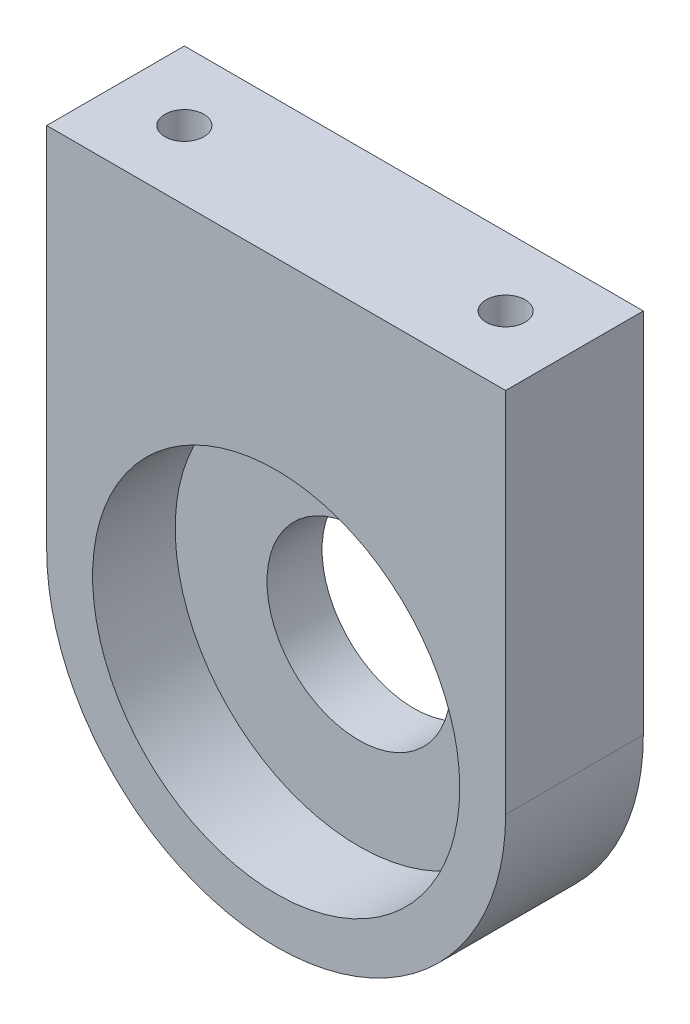
ISO-10303-21;
HEADER;
FILE_DESCRIPTION(('STEP AP214'),'2;1');
FILE_NAME('part.step','',(''),(''),'','','');
FILE_SCHEMA(('AUTOMOTIVE_DESIGN { 1 0 10303 214 1 1 1 1 }'));
ENDSEC;
DATA;
#1=APPLICATION_CONTEXT('core data for automotive mechanical design processes');
#2=APPLICATION_PROTOCOL_DEFINITION('international standard','automotive_design',2000,#1);
#3=PRODUCT_CONTEXT('',#1,'mechanical');
#4=PRODUCT('Part','Part','',(#3));
#5=PRODUCT_RELATED_PRODUCT_CATEGORY('part','',(#4));
#6=PRODUCT_DEFINITION_FORMATION('','',#4);
#7=PRODUCT_DEFINITION_CONTEXT('part definition',#1,'design');
#8=PRODUCT_DEFINITION('design','',#6,#7);
#9=PRODUCT_DEFINITION_SHAPE('','',#8);
#10=(LENGTH_UNIT() NAMED_UNIT(*) SI_UNIT(.MILLI.,.METRE.));
#11=(NAMED_UNIT(*) PLANE_ANGLE_UNIT() SI_UNIT($,.RADIAN.));
#12=(NAMED_UNIT(*) SI_UNIT($,.STERADIAN.) SOLID_ANGLE_UNIT());
#13=UNCERTAINTY_MEASURE_WITH_UNIT(LENGTH_MEASURE(1.E-05),#10,'distance_accuracy_value','');
#14=(GEOMETRIC_REPRESENTATION_CONTEXT(3) GLOBAL_UNCERTAINTY_ASSIGNED_CONTEXT((#13)) GLOBAL_UNIT_ASSIGNED_CONTEXT((#10,
#11,#12)) REPRESENTATION_CONTEXT('',''));
#15=CARTESIAN_POINT('',(0.,0.,0.));
#16=DIRECTION('',(0.,0.,1.));
#17=DIRECTION('',(1.,0.,0.));
#18=AXIS2_PLACEMENT_3D('',#15,#16,#17);
#19=CARTESIAN_POINT('',(0.,0.,-15.));
#20=DIRECTION('',(0.,0.,1.));
#21=DIRECTION('',(1.,0.,0.));
#22=AXIS2_PLACEMENT_3D('',#19,#20,#21);
#23=CYLINDRICAL_SURFACE('',#22,20.);
#24=CARTESIAN_POINT('',(0.,0.,-15.));
#25=DIRECTION('',(0.,0.,1.));
#26=DIRECTION('',(1.,0.,0.));
#27=AXIS2_PLACEMENT_3D('',#24,#25,#26);
#28=CIRCLE('',#27,20.);
#29=CARTESIAN_POINT('',(20.,0.,-15.));
#30=VERTEX_POINT('',#29);
#31=EDGE_CURVE('E130',#30,#30,#28,.T.);
#32=ORIENTED_EDGE('',*,*,#31,.F.);
#33=EDGE_LOOP('',(#32));
#34=FACE_BOUND('',#33,.T.);
#35=CARTESIAN_POINT('',(0.,0.,-3.));
#36=DIRECTION('',(0.,0.,1.));
#37=DIRECTION('',(1.,0.,0.));
#38=AXIS2_PLACEMENT_3D('',#35,#36,#37);
#39=CIRCLE('',#38,20.);
#40=CARTESIAN_POINT('',(20.,0.,-3.));
#41=VERTEX_POINT('',#40);
#42=EDGE_CURVE('E51',#41,#41,#39,.F.);
#43=ORIENTED_EDGE('',*,*,#42,.F.);
#44=EDGE_LOOP('',(#43));
#45=FACE_BOUND('',#44,.T.);
#46=ADVANCED_FACE('F47',(#34,#45),#23,.F.);
#47=CARTESIAN_POINT('',(50.,80.,15.));
#48=DIRECTION('',(0.,-1.,0.));
#49=DIRECTION('',(0.,0.,-1.));
#50=AXIS2_PLACEMENT_3D('',#47,#48,#49);
#51=PLANE('',#50);
#52=CARTESIAN_POINT('',(-35.,80.,0.));
#53=DIRECTION('',(0.,1.,0.));
#54=DIRECTION('',(0.,0.,1.));
#55=AXIS2_PLACEMENT_3D('',#52,#53,#54);
#56=CIRCLE('',#55,4.24999999999999);
#57=CARTESIAN_POINT('',(-35.,80.,4.24999999999999));
#58=VERTEX_POINT('',#57);
#59=EDGE_CURVE('E114',#58,#58,#56,.T.);
#60=ORIENTED_EDGE('',*,*,#59,.F.);
#61=EDGE_LOOP('',(#60));
#62=FACE_BOUND('',#61,.T.);
#63=CARTESIAN_POINT('',(35.,80.,0.));
#64=DIRECTION('',(0.,1.,0.));
#65=DIRECTION('',(0.,0.,1.));
#66=AXIS2_PLACEMENT_3D('',#63,#64,#65);
#67=CIRCLE('',#66,4.24999999999999);
#68=CARTESIAN_POINT('',(35.,80.,4.24999999999999));
#69=VERTEX_POINT('',#68);
#70=EDGE_CURVE('E113',#69,#69,#67,.T.);
#71=ORIENTED_EDGE('',*,*,#70,.F.);
#72=EDGE_LOOP('',(#71));
#73=FACE_BOUND('',#72,.T.);
#74=DIRECTION('',(-1.,0.,0.));
#75=VECTOR('',#74,1.);
#76=CARTESIAN_POINT('',(50.,80.,-15.));
#77=LINE('',#76,#75);
#78=CARTESIAN_POINT('',(50.,80.,-15.));
#79=VERTEX_POINT('',#78);
#80=CARTESIAN_POINT('',(-50.,80.,-15.));
#81=VERTEX_POINT('',#80);
#82=EDGE_CURVE('E133',#79,#81,#77,.T.);
#83=ORIENTED_EDGE('',*,*,#82,.T.);
#84=DIRECTION('',(0.,0.,-1.));
#85=VECTOR('',#84,1.);
#86=CARTESIAN_POINT('',(-50.,80.,15.));
#87=LINE('',#86,#85);
#88=CARTESIAN_POINT('',(-50.,80.,15.));
#89=VERTEX_POINT('',#88);
#90=EDGE_CURVE('E11',#89,#81,#87,.T.);
#91=ORIENTED_EDGE('',*,*,#90,.F.);
#92=DIRECTION('',(-1.,0.,0.));
#93=VECTOR('',#92,1.);
#94=CARTESIAN_POINT('',(50.,80.,15.));
#95=LINE('',#94,#93);
#96=CARTESIAN_POINT('',(50.,80.,15.));
#97=VERTEX_POINT('',#96);
#98=EDGE_CURVE('E134',#97,#89,#95,.T.);
#99=ORIENTED_EDGE('',*,*,#98,.F.);
#100=DIRECTION('',(0.,0.,-1.));
#101=VECTOR('',#100,1.);
#102=CARTESIAN_POINT('',(50.,80.,15.));
#103=LINE('',#102,#101);
#104=EDGE_CURVE('E140',#97,#79,#103,.T.);
#105=ORIENTED_EDGE('',*,*,#104,.T.);
#106=EDGE_LOOP('',(#83,#91,#99,#105));
#107=FACE_BOUND('',#106,.T.);
#108=ADVANCED_FACE('F49',(#62,#73,#107),#51,.F.);
#109=CARTESIAN_POINT('',(-50.,80.,15.));
#110=DIRECTION('',(1.,0.,0.));
#111=DIRECTION('',(0.,1.,0.));
#112=AXIS2_PLACEMENT_3D('',#109,#110,#111);
#113=PLANE('',#112);
#114=DIRECTION('',(0.,-1.,0.));
#115=VECTOR('',#114,1.);
#116=CARTESIAN_POINT('',(-50.,80.,-15.));
#117=LINE('',#116,#115);
#118=CARTESIAN_POINT('',(-50.,0.,-15.));
#119=VERTEX_POINT('',#118);
#120=EDGE_CURVE('E143',#81,#119,#117,.T.);
#121=ORIENTED_EDGE('',*,*,#120,.T.);
#122=DIRECTION('',(0.,0.,-1.));
#123=VECTOR('',#122,1.);
#124=CARTESIAN_POINT('',(-50.,0.,15.));
#125=LINE('',#124,#123);
#126=CARTESIAN_POINT('',(-50.,0.,15.));
#127=VERTEX_POINT('',#126);
#128=EDGE_CURVE('E57',#127,#119,#125,.T.);
#129=ORIENTED_EDGE('',*,*,#128,.F.);
#130=DIRECTION('',(0.,-1.,0.));
#131=VECTOR('',#130,1.);
#132=CARTESIAN_POINT('',(-50.,80.,15.));
#133=LINE('',#132,#131);
#134=EDGE_CURVE('E96',#89,#127,#133,.T.);
#135=ORIENTED_EDGE('',*,*,#134,.F.);
#136=ORIENTED_EDGE('',*,*,#90,.T.);
#137=EDGE_LOOP('',(#121,#129,#135,#136));
#138=FACE_BOUND('',#137,.T.);
#139=ADVANCED_FACE('F168',(#138),#113,.F.);
#140=CARTESIAN_POINT('',(0.,0.,15.));
#141=DIRECTION('',(0.,0.,-1.));
#142=DIRECTION('',(-1.,0.,0.));
#143=AXIS2_PLACEMENT_3D('',#140,#141,#142);
#144=CYLINDRICAL_SURFACE('',#143,50.);
#145=CARTESIAN_POINT('',(0.,0.,-15.));
#146=DIRECTION('',(0.,0.,1.));
#147=DIRECTION('',(1.,0.,0.));
#148=AXIS2_PLACEMENT_3D('',#145,#146,#147);
#149=CIRCLE('',#148,50.);
#150=CARTESIAN_POINT('',(50.,0.,-15.));
#151=VERTEX_POINT('',#150);
#152=EDGE_CURVE('E83',#119,#151,#149,.T.);
#153=ORIENTED_EDGE('',*,*,#152,.T.);
#154=DIRECTION('',(0.,0.,-1.));
#155=VECTOR('',#154,1.);
#156=CARTESIAN_POINT('',(50.,0.,15.));
#157=LINE('',#156,#155);
#158=CARTESIAN_POINT('',(50.,0.,15.));
#159=VERTEX_POINT('',#158);
#160=EDGE_CURVE('E148',#159,#151,#157,.T.);
#161=ORIENTED_EDGE('',*,*,#160,.F.);
#162=CARTESIAN_POINT('',(0.,0.,15.));
#163=DIRECTION('',(0.,0.,1.));
#164=DIRECTION('',(1.,0.,0.));
#165=AXIS2_PLACEMENT_3D('',#162,#163,#164);
#166=CIRCLE('',#165,50.);
#167=EDGE_CURVE('E137',#127,#159,#166,.T.);
#168=ORIENTED_EDGE('',*,*,#167,.F.);
#169=ORIENTED_EDGE('',*,*,#128,.T.);
#170=EDGE_LOOP('',(#153,#161,#168,#169));
#171=FACE_BOUND('',#170,.T.);
#172=ADVANCED_FACE('F151',(#171),#144,.T.);
#173=CARTESIAN_POINT('',(50.,0.,15.));
#174=DIRECTION('',(-1.,0.,0.));
#175=DIRECTION('',(0.,0.,1.));
#176=AXIS2_PLACEMENT_3D('',#173,#174,#175);
#177=PLANE('',#176);
#178=DIRECTION('',(0.,1.,0.));
#179=VECTOR('',#178,1.);
#180=CARTESIAN_POINT('',(50.,0.,-15.));
#181=LINE('',#180,#179);
#182=EDGE_CURVE('E89',#151,#79,#181,.T.);
#183=ORIENTED_EDGE('',*,*,#182,.T.);
#184=ORIENTED_EDGE('',*,*,#104,.F.);
#185=DIRECTION('',(0.,1.,0.));
#186=VECTOR('',#185,1.);
#187=CARTESIAN_POINT('',(50.,0.,15.));
#188=LINE('',#187,#186);
#189=EDGE_CURVE('E65',#159,#97,#188,.T.);
#190=ORIENTED_EDGE('',*,*,#189,.F.);
#191=ORIENTED_EDGE('',*,*,#160,.T.);
#192=EDGE_LOOP('',(#183,#184,#190,#191));
#193=FACE_BOUND('',#192,.T.);
#194=ADVANCED_FACE('F158',(#193),#177,.F.);
#195=CARTESIAN_POINT('',(0.,0.,15.));
#196=DIRECTION('',(0.,0.,1.));
#197=DIRECTION('',(1.,0.,0.));
#198=AXIS2_PLACEMENT_3D('',#195,#196,#197);
#199=PLANE('',#198);
#200=CARTESIAN_POINT('',(0.,0.,15.));
#201=DIRECTION('',(0.,0.,1.));
#202=DIRECTION('',(1.,0.,0.));
#203=AXIS2_PLACEMENT_3D('',#200,#201,#202);
#204=CIRCLE('',#203,40.);
#205=CARTESIAN_POINT('',(40.,0.,15.));
#206=VERTEX_POINT('',#205);
#207=EDGE_CURVE('E124',#206,#206,#204,.T.);
#208=ORIENTED_EDGE('',*,*,#207,.F.);
#209=EDGE_LOOP('',(#208));
#210=FACE_BOUND('',#209,.T.);
#211=ORIENTED_EDGE('',*,*,#98,.T.);
#212=ORIENTED_EDGE('',*,*,#134,.T.);
#213=ORIENTED_EDGE('',*,*,#167,.T.);
#214=ORIENTED_EDGE('',*,*,#189,.T.);
#215=EDGE_LOOP('',(#211,#212,#213,#214));
#216=FACE_BOUND('',#215,.T.);
#217=ADVANCED_FACE('F160',(#210,#216),#199,.T.);
#218=CARTESIAN_POINT('',(0.,0.,-15.));
#219=DIRECTION('',(0.,0.,1.));
#220=DIRECTION('',(1.,0.,0.));
#221=AXIS2_PLACEMENT_3D('',#218,#219,#220);
#222=PLANE('',#221);
#223=ORIENTED_EDGE('',*,*,#31,.T.);
#224=EDGE_LOOP('',(#223));
#225=FACE_BOUND('',#224,.T.);
#226=ORIENTED_EDGE('',*,*,#82,.F.);
#227=ORIENTED_EDGE('',*,*,#182,.F.);
#228=ORIENTED_EDGE('',*,*,#152,.F.);
#229=ORIENTED_EDGE('',*,*,#120,.F.);
#230=EDGE_LOOP('',(#226,#227,#228,#229));
#231=FACE_BOUND('',#230,.T.);
#232=ADVANCED_FACE('F154',(#225,#231),#222,.F.);
#233=CARTESIAN_POINT('',(0.,0.,-3.));
#234=DIRECTION('',(0.,0.,1.));
#235=DIRECTION('',(1.,0.,0.));
#236=AXIS2_PLACEMENT_3D('',#233,#234,#235);
#237=PLANE('',#236);
#238=CARTESIAN_POINT('',(0.,0.,-3.));
#239=DIRECTION('',(0.,0.,1.));
#240=DIRECTION('',(1.,0.,0.));
#241=AXIS2_PLACEMENT_3D('',#238,#239,#240);
#242=CIRCLE('',#241,40.);
#243=CARTESIAN_POINT('',(40.,0.,-3.));
#244=VERTEX_POINT('',#243);
#245=EDGE_CURVE('E125',#244,#244,#242,.T.);
#246=ORIENTED_EDGE('',*,*,#245,.T.);
#247=EDGE_LOOP('',(#246));
#248=FACE_BOUND('',#247,.T.);
#249=ORIENTED_EDGE('',*,*,#42,.T.);
#250=EDGE_LOOP('',(#249));
#251=FACE_BOUND('',#250,.T.);
#252=ADVANCED_FACE('F184',(#248,#251),#237,.T.);
#253=CARTESIAN_POINT('',(0.,0.,-3.));
#254=DIRECTION('',(0.,0.,1.));
#255=DIRECTION('',(1.,0.,0.));
#256=AXIS2_PLACEMENT_3D('',#253,#254,#255);
#257=CYLINDRICAL_SURFACE('',#256,40.);
#258=ORIENTED_EDGE('',*,*,#245,.F.);
#259=EDGE_LOOP('',(#258));
#260=FACE_BOUND('',#259,.T.);
#261=ORIENTED_EDGE('',*,*,#207,.T.);
#262=EDGE_LOOP('',(#261));
#263=FACE_BOUND('',#262,.T.);
#264=ADVANCED_FACE('F181',(#260,#263),#257,.F.);
#265=CARTESIAN_POINT('',(35.,55.5,0.));
#266=DIRECTION('',(0.,1.,0.));
#267=DIRECTION('',(0.,0.,1.));
#268=AXIS2_PLACEMENT_3D('',#265,#266,#267);
#269=CONICAL_SURFACE('',#268,4.24999999999999,0.785398163397447);
#270=CARTESIAN_POINT('',(35.,51.25,0.));
#271=VERTEX_POINT('',#270);
#272=VERTEX_LOOP('',#271);
#273=FACE_BOUND('',#272,.T.);
#274=CARTESIAN_POINT('',(35.,55.5,0.));
#275=DIRECTION('',(0.,1.,0.));
#276=DIRECTION('',(0.,0.,1.));
#277=AXIS2_PLACEMENT_3D('',#274,#275,#276);
#278=CIRCLE('',#277,4.24999999999999);
#279=CARTESIAN_POINT('',(35.,55.5,4.24999999999999));
#280=VERTEX_POINT('',#279);
#281=EDGE_CURVE('E117',#280,#280,#278,.T.);
#282=ORIENTED_EDGE('',*,*,#281,.T.);
#283=EDGE_LOOP('',(#282));
#284=FACE_BOUND('',#283,.T.);
#285=ADVANCED_FACE('F193',(#273,#284),#269,.F.);
#286=CARTESIAN_POINT('',(35.,80.,0.));
#287=DIRECTION('',(0.,1.,0.));
#288=DIRECTION('',(0.,0.,1.));
#289=AXIS2_PLACEMENT_3D('',#286,#287,#288);
#290=CYLINDRICAL_SURFACE('',#289,4.24999999999999);
#291=ORIENTED_EDGE('',*,*,#281,.F.);
#292=EDGE_LOOP('',(#291));
#293=FACE_BOUND('',#292,.T.);
#294=ORIENTED_EDGE('',*,*,#70,.T.);
#295=EDGE_LOOP('',(#294));
#296=FACE_BOUND('',#295,.T.);
#297=ADVANCED_FACE('F107',(#293,#296),#290,.F.);
#298=CARTESIAN_POINT('',(-35.,55.5,0.));
#299=DIRECTION('',(0.,1.,0.));
#300=DIRECTION('',(0.,0.,1.));
#301=AXIS2_PLACEMENT_3D('',#298,#299,#300);
#302=CONICAL_SURFACE('',#301,4.24999999999999,0.785398163397447);
#303=CARTESIAN_POINT('',(-35.,51.25,0.));
#304=VERTEX_POINT('',#303);
#305=VERTEX_LOOP('',#304);
#306=FACE_BOUND('',#305,.T.);
#307=CARTESIAN_POINT('',(-35.,55.5,0.));
#308=DIRECTION('',(0.,1.,0.));
#309=DIRECTION('',(0.,0.,1.));
#310=AXIS2_PLACEMENT_3D('',#307,#308,#309);
#311=CIRCLE('',#310,4.24999999999999);
#312=CARTESIAN_POINT('',(-35.,55.5,4.24999999999999));
#313=VERTEX_POINT('',#312);
#314=EDGE_CURVE('E111',#313,#313,#311,.T.);
#315=ORIENTED_EDGE('',*,*,#314,.T.);
#316=EDGE_LOOP('',(#315));
#317=FACE_BOUND('',#316,.T.);
#318=ADVANCED_FACE('F103',(#306,#317),#302,.F.);
#319=CARTESIAN_POINT('',(-35.,80.,0.));
#320=DIRECTION('',(0.,1.,0.));
#321=DIRECTION('',(0.,0.,1.));
#322=AXIS2_PLACEMENT_3D('',#319,#320,#321);
#323=CYLINDRICAL_SURFACE('',#322,4.24999999999999);
#324=ORIENTED_EDGE('',*,*,#314,.F.);
#325=EDGE_LOOP('',(#324));
#326=FACE_BOUND('',#325,.T.);
#327=ORIENTED_EDGE('',*,*,#59,.T.);
#328=EDGE_LOOP('',(#327));
#329=FACE_BOUND('',#328,.T.);
#330=ADVANCED_FACE('F106',(#326,#329),#323,.F.);
#331=CLOSED_SHELL('',(#46,#108,#139,#172,#194,#217,#232,#252,#264,#285,#297,#318,#330));
#332=MANIFOLD_SOLID_BREP('B2',#331);
#333=ADVANCED_BREP_SHAPE_REPRESENTATION('',(#18,#332),#14);
#334=SHAPE_DEFINITION_REPRESENTATION(#9,#333);
ENDSEC;
END-ISO-10303-21;
